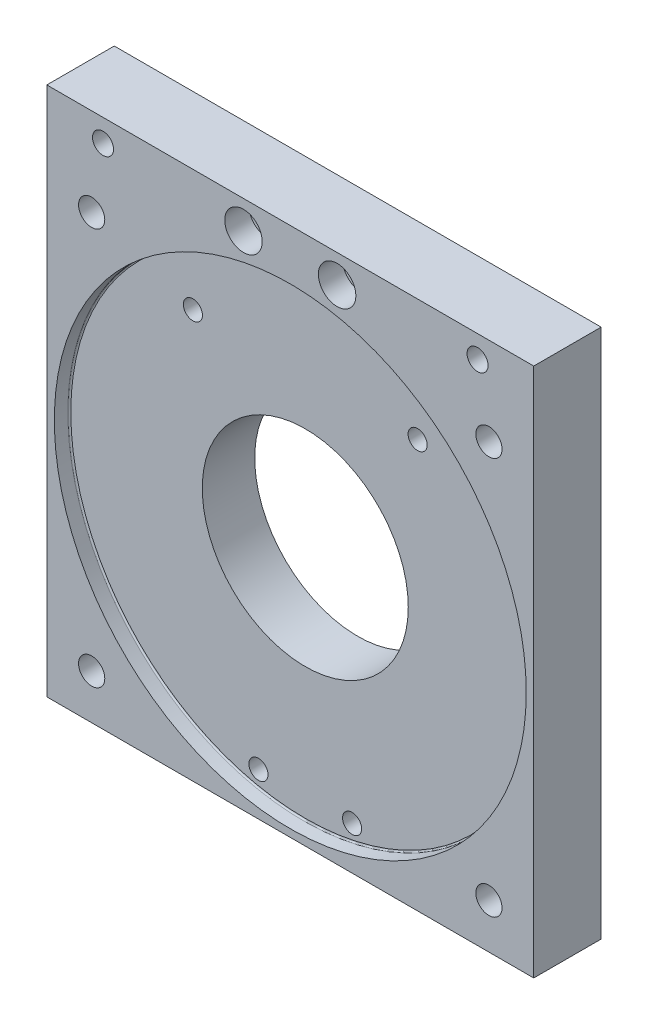
ISO-10303-21;
HEADER;
FILE_DESCRIPTION(('STEP AP214'),'2;1');
FILE_NAME('part.step','',(''),(''),'','','');
FILE_SCHEMA(('AUTOMOTIVE_DESIGN { 1 0 10303 214 1 1 1 1 }'));
ENDSEC;
DATA;
#1=APPLICATION_CONTEXT('core data for automotive mechanical design processes');
#2=APPLICATION_PROTOCOL_DEFINITION('international standard','automotive_design',2000,#1);
#3=PRODUCT_CONTEXT('',#1,'mechanical');
#4=PRODUCT('Part','Part','',(#3));
#5=PRODUCT_RELATED_PRODUCT_CATEGORY('part','',(#4));
#6=PRODUCT_DEFINITION_FORMATION('','',#4);
#7=PRODUCT_DEFINITION_CONTEXT('part definition',#1,'design');
#8=PRODUCT_DEFINITION('design','',#6,#7);
#9=PRODUCT_DEFINITION_SHAPE('','',#8);
#10=(LENGTH_UNIT() NAMED_UNIT(*) SI_UNIT(.MILLI.,.METRE.));
#11=(NAMED_UNIT(*) PLANE_ANGLE_UNIT() SI_UNIT($,.RADIAN.));
#12=(NAMED_UNIT(*) SI_UNIT($,.STERADIAN.) SOLID_ANGLE_UNIT());
#13=UNCERTAINTY_MEASURE_WITH_UNIT(LENGTH_MEASURE(1.E-05),#10,'distance_accuracy_value','');
#14=(GEOMETRIC_REPRESENTATION_CONTEXT(3) GLOBAL_UNCERTAINTY_ASSIGNED_CONTEXT((#13)) GLOBAL_UNIT_ASSIGNED_CONTEXT((#10,
#11,#12)) REPRESENTATION_CONTEXT('',''));
#15=CARTESIAN_POINT('',(0.,0.,0.));
#16=DIRECTION('',(0.,0.,1.));
#17=DIRECTION('',(1.,0.,0.));
#18=AXIS2_PLACEMENT_3D('',#15,#16,#17);
#19=CARTESIAN_POINT('',(-130.,130.,50.8));
#20=DIRECTION('',(1.,0.,0.));
#21=DIRECTION('',(0.,1.,0.));
#22=AXIS2_PLACEMENT_3D('',#19,#20,#21);
#23=PLANE('',#22);
#24=DIRECTION('',(0.,0.,-1.));
#25=VECTOR('',#24,1.);
#26=CARTESIAN_POINT('',(-130.,-130.,50.8));
#27=LINE('',#26,#25);
#28=CARTESIAN_POINT('',(-130.,-130.,43.4));
#29=VERTEX_POINT('',#28);
#30=CARTESIAN_POINT('',(-130.,-130.,7.4));
#31=VERTEX_POINT('',#30);
#32=EDGE_CURVE('E89',#29,#31,#27,.T.);
#33=ORIENTED_EDGE('',*,*,#32,.F.);
#34=DIRECTION('',(0.,1.,0.));
#35=VECTOR('',#34,1.);
#36=CARTESIAN_POINT('',(-130.,-130.,43.4));
#37=LINE('',#36,#35);
#38=CARTESIAN_POINT('',(-130.,153.,43.4));
#39=VERTEX_POINT('',#38);
#40=EDGE_CURVE('E78',#29,#39,#37,.T.);
#41=ORIENTED_EDGE('',*,*,#40,.T.);
#42=DIRECTION('',(0.,0.,-1.));
#43=VECTOR('',#42,1.);
#44=CARTESIAN_POINT('',(-130.,153.,50.8));
#45=LINE('',#44,#43);
#46=CARTESIAN_POINT('',(-130.,153.,7.4));
#47=VERTEX_POINT('',#46);
#48=EDGE_CURVE('E61',#39,#47,#45,.T.);
#49=ORIENTED_EDGE('',*,*,#48,.T.);
#50=DIRECTION('',(0.,-1.,0.));
#51=VECTOR('',#50,1.);
#52=CARTESIAN_POINT('',(-130.,153.,7.4));
#53=LINE('',#52,#51);
#54=EDGE_CURVE('E93',#47,#31,#53,.T.);
#55=ORIENTED_EDGE('',*,*,#54,.T.);
#56=EDGE_LOOP('',(#33,#41,#49,#55));
#57=FACE_BOUND('',#56,.T.);
#58=ADVANCED_FACE('F36',(#57),#23,.F.);
#59=CARTESIAN_POINT('',(-130.,-130.,50.8));
#60=DIRECTION('',(0.,1.,0.));
#61=DIRECTION('',(0.,0.,1.));
#62=AXIS2_PLACEMENT_3D('',#59,#60,#61);
#63=PLANE('',#62);
#64=DIRECTION('',(0.,0.,-1.));
#65=VECTOR('',#64,1.);
#66=CARTESIAN_POINT('',(130.,-130.,50.8));
#67=LINE('',#66,#65);
#68=CARTESIAN_POINT('',(130.,-130.,43.4));
#69=VERTEX_POINT('',#68);
#70=CARTESIAN_POINT('',(130.,-130.,7.4));
#71=VERTEX_POINT('',#70);
#72=EDGE_CURVE('E91',#69,#71,#67,.T.);
#73=ORIENTED_EDGE('',*,*,#72,.F.);
#74=DIRECTION('',(1.,0.,0.));
#75=VECTOR('',#74,1.);
#76=CARTESIAN_POINT('',(-130.,-130.,43.4));
#77=LINE('',#76,#75);
#78=EDGE_CURVE('E81',#29,#69,#77,.T.);
#79=ORIENTED_EDGE('',*,*,#78,.F.);
#80=ORIENTED_EDGE('',*,*,#32,.T.);
#81=DIRECTION('',(1.,0.,0.));
#82=VECTOR('',#81,1.);
#83=CARTESIAN_POINT('',(-130.,-130.,7.4));
#84=LINE('',#83,#82);
#85=EDGE_CURVE('E208',#31,#71,#84,.T.);
#86=ORIENTED_EDGE('',*,*,#85,.T.);
#87=EDGE_LOOP('',(#73,#79,#80,#86));
#88=FACE_BOUND('',#87,.T.);
#89=ADVANCED_FACE('F87',(#88),#63,.F.);
#90=CARTESIAN_POINT('',(130.,153.,50.8));
#91=DIRECTION('',(-1.,0.,0.));
#92=DIRECTION('',(0.,0.,1.));
#93=AXIS2_PLACEMENT_3D('',#90,#91,#92);
#94=PLANE('',#93);
#95=DIRECTION('',(0.,0.,-1.));
#96=VECTOR('',#95,1.);
#97=CARTESIAN_POINT('',(130.,153.,50.8));
#98=LINE('',#97,#96);
#99=CARTESIAN_POINT('',(130.,153.,43.4));
#100=VERTEX_POINT('',#99);
#101=CARTESIAN_POINT('',(130.,153.,7.4));
#102=VERTEX_POINT('',#101);
#103=EDGE_CURVE('E97',#100,#102,#98,.T.);
#104=ORIENTED_EDGE('',*,*,#103,.F.);
#105=DIRECTION('',(0.,1.,0.));
#106=VECTOR('',#105,1.);
#107=CARTESIAN_POINT('',(130.,-130.,43.4));
#108=LINE('',#107,#106);
#109=EDGE_CURVE('E53',#69,#100,#108,.T.);
#110=ORIENTED_EDGE('',*,*,#109,.F.);
#111=ORIENTED_EDGE('',*,*,#72,.T.);
#112=DIRECTION('',(0.,-1.,0.));
#113=VECTOR('',#112,1.);
#114=CARTESIAN_POINT('',(130.,153.,7.4));
#115=LINE('',#114,#113);
#116=EDGE_CURVE('E202',#102,#71,#115,.T.);
#117=ORIENTED_EDGE('',*,*,#116,.F.);
#118=EDGE_LOOP('',(#104,#110,#111,#117));
#119=FACE_BOUND('',#118,.T.);
#120=ADVANCED_FACE('F220',(#119),#94,.F.);
#121=CARTESIAN_POINT('',(-130.,153.,50.8));
#122=DIRECTION('',(0.,-1.,0.));
#123=DIRECTION('',(0.,0.,-1.));
#124=AXIS2_PLACEMENT_3D('',#121,#122,#123);
#125=PLANE('',#124);
#126=ORIENTED_EDGE('',*,*,#48,.F.);
#127=DIRECTION('',(1.,0.,0.));
#128=VECTOR('',#127,1.);
#129=CARTESIAN_POINT('',(-130.,153.,43.4));
#130=LINE('',#129,#128);
#131=EDGE_CURVE('E82',#39,#100,#130,.T.);
#132=ORIENTED_EDGE('',*,*,#131,.T.);
#133=ORIENTED_EDGE('',*,*,#103,.T.);
#134=DIRECTION('',(1.,0.,0.));
#135=VECTOR('',#134,1.);
#136=CARTESIAN_POINT('',(-130.,153.,7.4));
#137=LINE('',#136,#135);
#138=EDGE_CURVE('E205',#47,#102,#137,.T.);
#139=ORIENTED_EDGE('',*,*,#138,.F.);
#140=EDGE_LOOP('',(#126,#132,#133,#139));
#141=FACE_BOUND('',#140,.T.);
#142=ADVANCED_FACE('F215',(#141),#125,.F.);
#143=CARTESIAN_POINT('',(-130.,153.,7.4));
#144=DIRECTION('',(0.,0.,1.));
#145=DIRECTION('',(0.,-1.,0.));
#146=AXIS2_PLACEMENT_3D('',#143,#144,#145);
#147=PLANE('',#146);
#148=CARTESIAN_POINT('',(-100.,141.,7.4));
#149=DIRECTION('',(0.,0.,-1.));
#150=DIRECTION('',(0.,1.,0.));
#151=AXIS2_PLACEMENT_3D('',#148,#149,#150);
#152=CIRCLE('',#151,2.5);
#153=CARTESIAN_POINT('',(-100.,143.5,7.4));
#154=VERTEX_POINT('',#153);
#155=EDGE_CURVE('E115',#154,#154,#152,.T.);
#156=ORIENTED_EDGE('',*,*,#155,.F.);
#157=EDGE_LOOP('',(#156));
#158=FACE_BOUND('',#157,.T.);
#159=CARTESIAN_POINT('',(100.,141.,7.4));
#160=DIRECTION('',(0.,0.,-1.));
#161=DIRECTION('',(0.,1.,0.));
#162=AXIS2_PLACEMENT_3D('',#159,#160,#161);
#163=CIRCLE('',#162,2.5);
#164=CARTESIAN_POINT('',(100.,143.5,7.4));
#165=VERTEX_POINT('',#164);
#166=EDGE_CURVE('E120',#165,#165,#163,.T.);
#167=ORIENTED_EDGE('',*,*,#166,.F.);
#168=EDGE_LOOP('',(#167));
#169=FACE_BOUND('',#168,.T.);
#170=CARTESIAN_POINT('',(60.,80.,7.4));
#171=DIRECTION('',(0.,0.,-1.));
#172=DIRECTION('',(-1.,0.,0.));
#173=AXIS2_PLACEMENT_3D('',#170,#171,#172);
#174=CIRCLE('',#173,5.09999999999999);
#175=CARTESIAN_POINT('',(54.9,80.,7.4));
#176=VERTEX_POINT('',#175);
#177=EDGE_CURVE('E112',#176,#176,#174,.T.);
#178=ORIENTED_EDGE('',*,*,#177,.F.);
#179=EDGE_LOOP('',(#178));
#180=FACE_BOUND('',#179,.T.);
#181=CARTESIAN_POINT('',(-60.,80.,7.4));
#182=DIRECTION('',(0.,0.,-1.));
#183=DIRECTION('',(-1.,0.,0.));
#184=AXIS2_PLACEMENT_3D('',#181,#182,#183);
#185=CIRCLE('',#184,5.09999999999999);
#186=CARTESIAN_POINT('',(-65.1,80.,7.4));
#187=VERTEX_POINT('',#186);
#188=EDGE_CURVE('E109',#187,#187,#185,.T.);
#189=ORIENTED_EDGE('',*,*,#188,.F.);
#190=EDGE_LOOP('',(#189));
#191=FACE_BOUND('',#190,.T.);
#192=CARTESIAN_POINT('',(-25.,-115.,7.4));
#193=DIRECTION('',(0.,0.,-1.));
#194=DIRECTION('',(-1.,0.,0.));
#195=AXIS2_PLACEMENT_3D('',#192,#193,#194);
#196=CIRCLE('',#195,5.09999999999999);
#197=CARTESIAN_POINT('',(-30.1,-115.,7.4));
#198=VERTEX_POINT('',#197);
#199=EDGE_CURVE('E105',#198,#198,#196,.T.);
#200=ORIENTED_EDGE('',*,*,#199,.F.);
#201=EDGE_LOOP('',(#200));
#202=FACE_BOUND('',#201,.T.);
#203=CARTESIAN_POINT('',(25.,-115.,7.4));
#204=DIRECTION('',(0.,0.,-1.));
#205=DIRECTION('',(-1.,0.,0.));
#206=AXIS2_PLACEMENT_3D('',#203,#204,#205);
#207=CIRCLE('',#206,5.09999999999999);
#208=CARTESIAN_POINT('',(19.9,-115.,7.4));
#209=VERTEX_POINT('',#208);
#210=EDGE_CURVE('E104',#209,#209,#207,.T.);
#211=ORIENTED_EDGE('',*,*,#210,.F.);
#212=EDGE_LOOP('',(#211));
#213=FACE_BOUND('',#212,.T.);
#214=CARTESIAN_POINT('',(-25.0000000000001,138.,7.40000000000001));
#215=DIRECTION('',(0.,0.,1.));
#216=DIRECTION('',(1.,0.,0.));
#217=AXIS2_PLACEMENT_3D('',#214,#215,#216);
#218=CIRCLE('',#217,6.74999999999999);
#219=CARTESIAN_POINT('',(-18.2500000000001,138.,7.40000000000001));
#220=VERTEX_POINT('',#219);
#221=EDGE_CURVE('E153',#220,#220,#218,.T.);
#222=ORIENTED_EDGE('',*,*,#221,.T.);
#223=EDGE_LOOP('',(#222));
#224=FACE_BOUND('',#223,.T.);
#225=CARTESIAN_POINT('',(25.,138.,7.40000000000001));
#226=DIRECTION('',(0.,0.,1.));
#227=DIRECTION('',(1.,0.,0.));
#228=AXIS2_PLACEMENT_3D('',#225,#226,#227);
#229=CIRCLE('',#228,6.74999999999999);
#230=CARTESIAN_POINT('',(31.75,138.,7.40000000000001));
#231=VERTEX_POINT('',#230);
#232=EDGE_CURVE('E165',#231,#231,#229,.T.);
#233=ORIENTED_EDGE('',*,*,#232,.T.);
#234=EDGE_LOOP('',(#233));
#235=FACE_BOUND('',#234,.T.);
#236=CARTESIAN_POINT('',(0.,0.,7.4));
#237=DIRECTION('',(0.,0.,1.));
#238=DIRECTION('',(1.,0.,0.));
#239=AXIS2_PLACEMENT_3D('',#236,#237,#238);
#240=CIRCLE('',#239,55.);
#241=CARTESIAN_POINT('',(55.,0.,7.4));
#242=VERTEX_POINT('',#241);
#243=EDGE_CURVE('E169',#242,#242,#240,.T.);
#244=ORIENTED_EDGE('',*,*,#243,.T.);
#245=EDGE_LOOP('',(#244));
#246=FACE_BOUND('',#245,.T.);
#247=CARTESIAN_POINT('',(-106.066017177982,106.066017177982,7.4));
#248=DIRECTION('',(0.,0.,1.));
#249=DIRECTION('',(1.,0.,0.));
#250=AXIS2_PLACEMENT_3D('',#247,#248,#249);
#251=CIRCLE('',#250,6.99999999999999);
#252=CARTESIAN_POINT('',(-99.0660171779821,106.066017177982,7.4));
#253=VERTEX_POINT('',#252);
#254=EDGE_CURVE('E177',#253,#253,#251,.T.);
#255=ORIENTED_EDGE('',*,*,#254,.T.);
#256=EDGE_LOOP('',(#255));
#257=FACE_BOUND('',#256,.T.);
#258=CARTESIAN_POINT('',(106.066017177982,106.066017177982,7.4));
#259=DIRECTION('',(0.,0.,1.));
#260=DIRECTION('',(1.,0.,0.));
#261=AXIS2_PLACEMENT_3D('',#258,#259,#260);
#262=CIRCLE('',#261,6.99999999999999);
#263=CARTESIAN_POINT('',(113.066017177982,106.066017177982,7.4));
#264=VERTEX_POINT('',#263);
#265=EDGE_CURVE('E183',#264,#264,#262,.T.);
#266=ORIENTED_EDGE('',*,*,#265,.T.);
#267=EDGE_LOOP('',(#266));
#268=FACE_BOUND('',#267,.T.);
#269=CARTESIAN_POINT('',(106.066017177982,-106.066017177982,7.4));
#270=DIRECTION('',(0.,0.,1.));
#271=DIRECTION('',(1.,0.,0.));
#272=AXIS2_PLACEMENT_3D('',#269,#270,#271);
#273=CIRCLE('',#272,6.99999999999999);
#274=CARTESIAN_POINT('',(113.066017177982,-106.066017177982,7.4));
#275=VERTEX_POINT('',#274);
#276=EDGE_CURVE('E189',#275,#275,#273,.T.);
#277=ORIENTED_EDGE('',*,*,#276,.T.);
#278=EDGE_LOOP('',(#277));
#279=FACE_BOUND('',#278,.T.);
#280=CARTESIAN_POINT('',(-106.066017177982,-106.066017177982,7.4));
#281=DIRECTION('',(0.,0.,1.));
#282=DIRECTION('',(1.,0.,0.));
#283=AXIS2_PLACEMENT_3D('',#280,#281,#282);
#284=CIRCLE('',#283,6.99999999999999);
#285=CARTESIAN_POINT('',(-99.0660171779821,-106.066017177982,7.4));
#286=VERTEX_POINT('',#285);
#287=EDGE_CURVE('E195',#286,#286,#284,.T.);
#288=ORIENTED_EDGE('',*,*,#287,.T.);
#289=EDGE_LOOP('',(#288));
#290=FACE_BOUND('',#289,.T.);
#291=ORIENTED_EDGE('',*,*,#116,.T.);
#292=ORIENTED_EDGE('',*,*,#85,.F.);
#293=ORIENTED_EDGE('',*,*,#54,.F.);
#294=ORIENTED_EDGE('',*,*,#138,.T.);
#295=EDGE_LOOP('',(#291,#292,#293,#294));
#296=FACE_BOUND('',#295,.T.);
#297=ADVANCED_FACE('F219',(#158,#169,#180,#191,#202,#213,#224,#235,#246,#257,#268,#279,#290,
#296),#147,.F.);
#298=CARTESIAN_POINT('',(-130.,-130.,43.4));
#299=DIRECTION('',(0.,0.,-1.));
#300=DIRECTION('',(-1.,0.,0.));
#301=AXIS2_PLACEMENT_3D('',#298,#299,#300);
#302=PLANE('',#301);
#303=CARTESIAN_POINT('',(100.,141.,43.4));
#304=DIRECTION('',(0.,0.,1.));
#305=DIRECTION('',(1.,0.,0.));
#306=AXIS2_PLACEMENT_3D('',#303,#304,#305);
#307=CIRCLE('',#306,5.59999999999999);
#308=CARTESIAN_POINT('',(105.6,141.,43.4));
#309=VERTEX_POINT('',#308);
#310=EDGE_CURVE('E521',#309,#309,#307,.T.);
#311=ORIENTED_EDGE('',*,*,#310,.F.);
#312=EDGE_LOOP('',(#311));
#313=FACE_BOUND('',#312,.T.);
#314=CARTESIAN_POINT('',(-100.,141.,43.4));
#315=DIRECTION('',(0.,0.,1.));
#316=DIRECTION('',(1.,0.,0.));
#317=AXIS2_PLACEMENT_3D('',#314,#315,#316);
#318=CIRCLE('',#317,5.59999999999999);
#319=CARTESIAN_POINT('',(-94.4,141.,43.4));
#320=VERTEX_POINT('',#319);
#321=EDGE_CURVE('E123',#320,#320,#318,.T.);
#322=ORIENTED_EDGE('',*,*,#321,.F.);
#323=EDGE_LOOP('',(#322));
#324=FACE_BOUND('',#323,.T.);
#325=CARTESIAN_POINT('',(-25.0000000000001,138.,43.4));
#326=DIRECTION('',(0.,0.,1.));
#327=DIRECTION('',(1.,0.,0.));
#328=AXIS2_PLACEMENT_3D('',#325,#326,#327);
#329=CIRCLE('',#328,10.);
#330=CARTESIAN_POINT('',(-15.0000000000001,138.,43.4));
#331=VERTEX_POINT('',#330);
#332=EDGE_CURVE('E144',#331,#331,#329,.T.);
#333=ORIENTED_EDGE('',*,*,#332,.F.);
#334=EDGE_LOOP('',(#333));
#335=FACE_BOUND('',#334,.T.);
#336=CARTESIAN_POINT('',(25.,138.,43.4));
#337=DIRECTION('',(0.,0.,1.));
#338=DIRECTION('',(1.,0.,0.));
#339=AXIS2_PLACEMENT_3D('',#336,#337,#338);
#340=CIRCLE('',#339,9.99999999999999);
#341=CARTESIAN_POINT('',(35.,138.,43.4));
#342=VERTEX_POINT('',#341);
#343=EDGE_CURVE('E156',#342,#342,#340,.T.);
#344=ORIENTED_EDGE('',*,*,#343,.F.);
#345=EDGE_LOOP('',(#344));
#346=FACE_BOUND('',#345,.T.);
#347=CARTESIAN_POINT('',(-106.066017177982,106.066017177982,43.4));
#348=DIRECTION('',(0.,0.,1.));
#349=DIRECTION('',(1.,0.,0.));
#350=AXIS2_PLACEMENT_3D('',#347,#348,#349);
#351=CIRCLE('',#350,6.99999999999999);
#352=CARTESIAN_POINT('',(-99.0660171779821,106.066017177982,43.4));
#353=VERTEX_POINT('',#352);
#354=EDGE_CURVE('E172',#353,#353,#351,.T.);
#355=ORIENTED_EDGE('',*,*,#354,.F.);
#356=EDGE_LOOP('',(#355));
#357=FACE_BOUND('',#356,.T.);
#358=CARTESIAN_POINT('',(106.066017177982,106.066017177982,43.4));
#359=DIRECTION('',(0.,0.,1.));
#360=DIRECTION('',(1.,0.,0.));
#361=AXIS2_PLACEMENT_3D('',#358,#359,#360);
#362=CIRCLE('',#361,6.99999999999999);
#363=CARTESIAN_POINT('',(113.066017177982,106.066017177982,43.4));
#364=VERTEX_POINT('',#363);
#365=EDGE_CURVE('E180',#364,#364,#362,.T.);
#366=ORIENTED_EDGE('',*,*,#365,.F.);
#367=EDGE_LOOP('',(#366));
#368=FACE_BOUND('',#367,.T.);
#369=CARTESIAN_POINT('',(106.066017177982,-106.066017177982,43.4));
#370=DIRECTION('',(0.,0.,1.));
#371=DIRECTION('',(1.,0.,0.));
#372=AXIS2_PLACEMENT_3D('',#369,#370,#371);
#373=CIRCLE('',#372,6.99999999999999);
#374=CARTESIAN_POINT('',(113.066017177982,-106.066017177982,43.4));
#375=VERTEX_POINT('',#374);
#376=EDGE_CURVE('E186',#375,#375,#373,.T.);
#377=ORIENTED_EDGE('',*,*,#376,.F.);
#378=EDGE_LOOP('',(#377));
#379=FACE_BOUND('',#378,.T.);
#380=CARTESIAN_POINT('',(-106.066017177982,-106.066017177982,43.4));
#381=DIRECTION('',(0.,0.,1.));
#382=DIRECTION('',(1.,0.,0.));
#383=AXIS2_PLACEMENT_3D('',#380,#381,#382);
#384=CIRCLE('',#383,6.99999999999999);
#385=CARTESIAN_POINT('',(-99.0660171779821,-106.066017177982,43.4));
#386=VERTEX_POINT('',#385);
#387=EDGE_CURVE('E192',#386,#386,#384,.T.);
#388=ORIENTED_EDGE('',*,*,#387,.F.);
#389=EDGE_LOOP('',(#388));
#390=FACE_BOUND('',#389,.T.);
#391=CARTESIAN_POINT('',(0.,0.,43.4));
#392=DIRECTION('',(0.,0.,1.));
#393=DIRECTION('',(1.,0.,0.));
#394=AXIS2_PLACEMENT_3D('',#391,#392,#393);
#395=CIRCLE('',#394,126.);
#396=CARTESIAN_POINT('',(126.,0.,43.4));
#397=VERTEX_POINT('',#396);
#398=EDGE_CURVE('E198',#397,#397,#395,.T.);
#399=ORIENTED_EDGE('',*,*,#398,.F.);
#400=EDGE_LOOP('',(#399));
#401=FACE_BOUND('',#400,.T.);
#402=ORIENTED_EDGE('',*,*,#109,.T.);
#403=ORIENTED_EDGE('',*,*,#131,.F.);
#404=ORIENTED_EDGE('',*,*,#40,.F.);
#405=ORIENTED_EDGE('',*,*,#78,.T.);
#406=EDGE_LOOP('',(#402,#403,#404,#405));
#407=FACE_BOUND('',#406,.T.);
#408=ADVANCED_FACE('F80',(#313,#324,#335,#346,#357,#368,#379,#390,#401,#407),#302,.F.);
#409=CARTESIAN_POINT('',(0.,0.,35.4));
#410=DIRECTION('',(0.,0.,1.));
#411=DIRECTION('',(1.,0.,0.));
#412=AXIS2_PLACEMENT_3D('',#409,#410,#411);
#413=CYLINDRICAL_SURFACE('',#412,126.);
#414=CARTESIAN_POINT('',(0.,0.,36.19375));
#415=DIRECTION('',(0.,0.,1.));
#416=DIRECTION('',(1.,0.,0.));
#417=AXIS2_PLACEMENT_3D('',#414,#415,#416);
#418=CIRCLE('',#417,126.);
#419=CARTESIAN_POINT('',(126.,0.,36.19375));
#420=VERTEX_POINT('',#419);
#421=EDGE_CURVE('E11',#420,#420,#418,.F.);
#422=ORIENTED_EDGE('',*,*,#421,.T.);
#423=EDGE_LOOP('',(#422));
#424=FACE_BOUND('',#423,.T.);
#425=ORIENTED_EDGE('',*,*,#398,.T.);
#426=EDGE_LOOP('',(#425));
#427=FACE_BOUND('',#426,.T.);
#428=ADVANCED_FACE('F313',(#424,#427),#413,.F.);
#429=CARTESIAN_POINT('',(0.,0.,35.4));
#430=DIRECTION('',(0.,0.,1.));
#431=DIRECTION('',(1.,0.,0.));
#432=AXIS2_PLACEMENT_3D('',#429,#430,#431);
#433=PLANE('',#432);
#434=CARTESIAN_POINT('',(60.,80.,35.4));
#435=DIRECTION('',(0.,0.,1.));
#436=DIRECTION('',(1.,0.,0.));
#437=AXIS2_PLACEMENT_3D('',#434,#435,#436);
#438=CIRCLE('',#437,5.09999999999999);
#439=CARTESIAN_POINT('',(65.1,80.,35.4));
#440=VERTEX_POINT('',#439);
#441=EDGE_CURVE('E110',#440,#440,#438,.T.);
#442=ORIENTED_EDGE('',*,*,#441,.F.);
#443=EDGE_LOOP('',(#442));
#444=FACE_BOUND('',#443,.T.);
#445=CARTESIAN_POINT('',(-60.,80.,35.4));
#446=DIRECTION('',(0.,0.,1.));
#447=DIRECTION('',(1.,0.,0.));
#448=AXIS2_PLACEMENT_3D('',#445,#446,#447);
#449=CIRCLE('',#448,5.09999999999999);
#450=CARTESIAN_POINT('',(-54.9,80.,35.4));
#451=VERTEX_POINT('',#450);
#452=EDGE_CURVE('E106',#451,#451,#449,.T.);
#453=ORIENTED_EDGE('',*,*,#452,.F.);
#454=EDGE_LOOP('',(#453));
#455=FACE_BOUND('',#454,.T.);
#456=CARTESIAN_POINT('',(-25.,-115.,35.4));
#457=DIRECTION('',(0.,0.,1.));
#458=DIRECTION('',(1.,0.,0.));
#459=AXIS2_PLACEMENT_3D('',#456,#457,#458);
#460=CIRCLE('',#459,5.09999999999999);
#461=CARTESIAN_POINT('',(-19.9,-115.,35.4));
#462=VERTEX_POINT('',#461);
#463=EDGE_CURVE('E101',#462,#462,#460,.T.);
#464=ORIENTED_EDGE('',*,*,#463,.F.);
#465=EDGE_LOOP('',(#464));
#466=FACE_BOUND('',#465,.T.);
#467=CARTESIAN_POINT('',(25.,-115.,35.4));
#468=DIRECTION('',(0.,0.,1.));
#469=DIRECTION('',(1.,0.,0.));
#470=AXIS2_PLACEMENT_3D('',#467,#468,#469);
#471=CIRCLE('',#470,5.09999999999999);
#472=CARTESIAN_POINT('',(30.1,-115.,35.4));
#473=VERTEX_POINT('',#472);
#474=EDGE_CURVE('E141',#473,#473,#471,.T.);
#475=ORIENTED_EDGE('',*,*,#474,.F.);
#476=EDGE_LOOP('',(#475));
#477=FACE_BOUND('',#476,.T.);
#478=CARTESIAN_POINT('',(0.,0.,35.4));
#479=DIRECTION('',(0.,0.,1.));
#480=DIRECTION('',(1.,0.,0.));
#481=AXIS2_PLACEMENT_3D('',#478,#479,#480);
#482=CIRCLE('',#481,125.20625);
#483=CARTESIAN_POINT('',(125.20625,0.,35.4));
#484=VERTEX_POINT('',#483);
#485=EDGE_CURVE('E45',#484,#484,#482,.T.);
#486=ORIENTED_EDGE('',*,*,#485,.T.);
#487=EDGE_LOOP('',(#486));
#488=FACE_BOUND('',#487,.T.);
#489=CARTESIAN_POINT('',(0.,0.,35.4));
#490=DIRECTION('',(0.,0.,1.));
#491=DIRECTION('',(1.,0.,0.));
#492=AXIS2_PLACEMENT_3D('',#489,#490,#491);
#493=CIRCLE('',#492,55.);
#494=CARTESIAN_POINT('',(55.,0.,35.4));
#495=VERTEX_POINT('',#494);
#496=EDGE_CURVE('E168',#495,#495,#493,.T.);
#497=ORIENTED_EDGE('',*,*,#496,.F.);
#498=EDGE_LOOP('',(#497));
#499=FACE_BOUND('',#498,.T.);
#500=ADVANCED_FACE('F261',(#444,#455,#466,#477,#488,#499),#433,.T.);
#501=CARTESIAN_POINT('',(-106.066017177982,-106.066017177982,43.4));
#502=DIRECTION('',(0.,0.,1.));
#503=DIRECTION('',(1.,0.,0.));
#504=AXIS2_PLACEMENT_3D('',#501,#502,#503);
#505=CYLINDRICAL_SURFACE('',#504,6.99999999999999);
#506=ORIENTED_EDGE('',*,*,#287,.F.);
#507=EDGE_LOOP('',(#506));
#508=FACE_BOUND('',#507,.T.);
#509=ORIENTED_EDGE('',*,*,#387,.T.);
#510=EDGE_LOOP('',(#509));
#511=FACE_BOUND('',#510,.T.);
#512=ADVANCED_FACE('F254',(#508,#511),#505,.F.);
#513=CARTESIAN_POINT('',(106.066017177982,-106.066017177982,43.4));
#514=DIRECTION('',(0.,0.,1.));
#515=DIRECTION('',(1.,0.,0.));
#516=AXIS2_PLACEMENT_3D('',#513,#514,#515);
#517=CYLINDRICAL_SURFACE('',#516,6.99999999999999);
#518=ORIENTED_EDGE('',*,*,#276,.F.);
#519=EDGE_LOOP('',(#518));
#520=FACE_BOUND('',#519,.T.);
#521=ORIENTED_EDGE('',*,*,#376,.T.);
#522=EDGE_LOOP('',(#521));
#523=FACE_BOUND('',#522,.T.);
#524=ADVANCED_FACE('F260',(#520,#523),#517,.F.);
#525=CARTESIAN_POINT('',(106.066017177982,106.066017177982,43.4));
#526=DIRECTION('',(0.,0.,1.));
#527=DIRECTION('',(1.,0.,0.));
#528=AXIS2_PLACEMENT_3D('',#525,#526,#527);
#529=CYLINDRICAL_SURFACE('',#528,6.99999999999999);
#530=ORIENTED_EDGE('',*,*,#265,.F.);
#531=EDGE_LOOP('',(#530));
#532=FACE_BOUND('',#531,.T.);
#533=ORIENTED_EDGE('',*,*,#365,.T.);
#534=EDGE_LOOP('',(#533));
#535=FACE_BOUND('',#534,.T.);
#536=ADVANCED_FACE('F274',(#532,#535),#529,.F.);
#537=CARTESIAN_POINT('',(-106.066017177982,106.066017177982,43.4));
#538=DIRECTION('',(0.,0.,1.));
#539=DIRECTION('',(1.,0.,0.));
#540=AXIS2_PLACEMENT_3D('',#537,#538,#539);
#541=CYLINDRICAL_SURFACE('',#540,6.99999999999999);
#542=ORIENTED_EDGE('',*,*,#254,.F.);
#543=EDGE_LOOP('',(#542));
#544=FACE_BOUND('',#543,.T.);
#545=ORIENTED_EDGE('',*,*,#354,.T.);
#546=EDGE_LOOP('',(#545));
#547=FACE_BOUND('',#546,.T.);
#548=ADVANCED_FACE('F285',(#544,#547),#541,.F.);
#549=CARTESIAN_POINT('',(0.,0.,7.4));
#550=DIRECTION('',(0.,0.,1.));
#551=DIRECTION('',(1.,0.,0.));
#552=AXIS2_PLACEMENT_3D('',#549,#550,#551);
#553=CYLINDRICAL_SURFACE('',#552,55.);
#554=ORIENTED_EDGE('',*,*,#243,.F.);
#555=EDGE_LOOP('',(#554));
#556=FACE_BOUND('',#555,.T.);
#557=ORIENTED_EDGE('',*,*,#496,.T.);
#558=EDGE_LOOP('',(#557));
#559=FACE_BOUND('',#558,.T.);
#560=ADVANCED_FACE('F296',(#556,#559),#553,.F.);
#561=CARTESIAN_POINT('',(0.,0.,36.19375));
#562=DIRECTION('',(0.,0.,1.));
#563=DIRECTION('',(1.,0.,0.));
#564=AXIS2_PLACEMENT_3D('',#561,#562,#563);
#565=TOROIDAL_SURFACE('',#564,125.20625,0.79375);
#566=ORIENTED_EDGE('',*,*,#421,.F.);
#567=EDGE_LOOP('',(#566));
#568=FACE_BOUND('',#567,.T.);
#569=ORIENTED_EDGE('',*,*,#485,.F.);
#570=EDGE_LOOP('',(#569));
#571=FACE_BOUND('',#570,.T.);
#572=ADVANCED_FACE('F38',(#568,#571),#565,.F.);
#573=CARTESIAN_POINT('',(25.,138.,43.4));
#574=DIRECTION('',(0.,0.,1.));
#575=DIRECTION('',(1.,0.,0.));
#576=AXIS2_PLACEMENT_3D('',#573,#574,#575);
#577=CYLINDRICAL_SURFACE('',#576,6.75);
#578=ORIENTED_EDGE('',*,*,#232,.F.);
#579=EDGE_LOOP('',(#578));
#580=FACE_BOUND('',#579,.T.);
#581=CARTESIAN_POINT('',(25.,138.,30.4));
#582=DIRECTION('',(0.,0.,1.));
#583=DIRECTION('',(1.,0.,0.));
#584=AXIS2_PLACEMENT_3D('',#581,#582,#583);
#585=CIRCLE('',#584,6.75000000000001);
#586=CARTESIAN_POINT('',(31.75,138.,30.4));
#587=VERTEX_POINT('',#586);
#588=EDGE_CURVE('E162',#587,#587,#585,.T.);
#589=ORIENTED_EDGE('',*,*,#588,.T.);
#590=EDGE_LOOP('',(#589));
#591=FACE_BOUND('',#590,.T.);
#592=ADVANCED_FACE('F328',(#580,#591),#577,.F.);
#593=CARTESIAN_POINT('',(31.75,138.,30.4));
#594=DIRECTION('',(0.,0.,-1.));
#595=DIRECTION('',(-1.,0.,0.));
#596=AXIS2_PLACEMENT_3D('',#593,#594,#595);
#597=PLANE('',#596);
#598=ORIENTED_EDGE('',*,*,#588,.F.);
#599=EDGE_LOOP('',(#598));
#600=FACE_BOUND('',#599,.T.);
#601=CARTESIAN_POINT('',(25.,138.,30.4));
#602=DIRECTION('',(0.,0.,1.));
#603=DIRECTION('',(1.,0.,0.));
#604=AXIS2_PLACEMENT_3D('',#601,#602,#603);
#605=CIRCLE('',#604,9.99999999999999);
#606=CARTESIAN_POINT('',(35.,138.,30.4));
#607=VERTEX_POINT('',#606);
#608=EDGE_CURVE('E159',#607,#607,#605,.T.);
#609=ORIENTED_EDGE('',*,*,#608,.T.);
#610=EDGE_LOOP('',(#609));
#611=FACE_BOUND('',#610,.T.);
#612=ADVANCED_FACE('F337',(#600,#611),#597,.F.);
#613=CARTESIAN_POINT('',(25.,138.,43.4));
#614=DIRECTION('',(0.,0.,1.));
#615=DIRECTION('',(1.,0.,0.));
#616=AXIS2_PLACEMENT_3D('',#613,#614,#615);
#617=CYLINDRICAL_SURFACE('',#616,9.99999999999999);
#618=ORIENTED_EDGE('',*,*,#608,.F.);
#619=EDGE_LOOP('',(#618));
#620=FACE_BOUND('',#619,.T.);
#621=ORIENTED_EDGE('',*,*,#343,.T.);
#622=EDGE_LOOP('',(#621));
#623=FACE_BOUND('',#622,.T.);
#624=ADVANCED_FACE('F347',(#620,#623),#617,.F.);
#625=CARTESIAN_POINT('',(-25.0000000000001,138.,43.4));
#626=DIRECTION('',(0.,0.,1.));
#627=DIRECTION('',(1.,0.,0.));
#628=AXIS2_PLACEMENT_3D('',#625,#626,#627);
#629=CYLINDRICAL_SURFACE('',#628,6.75);
#630=ORIENTED_EDGE('',*,*,#221,.F.);
#631=EDGE_LOOP('',(#630));
#632=FACE_BOUND('',#631,.T.);
#633=CARTESIAN_POINT('',(-25.0000000000001,138.,30.4));
#634=DIRECTION('',(0.,0.,1.));
#635=DIRECTION('',(1.,0.,0.));
#636=AXIS2_PLACEMENT_3D('',#633,#634,#635);
#637=CIRCLE('',#636,6.75000000000001);
#638=CARTESIAN_POINT('',(-18.2500000000001,138.,30.4));
#639=VERTEX_POINT('',#638);
#640=EDGE_CURVE('E150',#639,#639,#637,.T.);
#641=ORIENTED_EDGE('',*,*,#640,.T.);
#642=EDGE_LOOP('',(#641));
#643=FACE_BOUND('',#642,.T.);
#644=ADVANCED_FACE('F357',(#632,#643),#629,.F.);
#645=CARTESIAN_POINT('',(-18.2500000000001,138.,30.4));
#646=DIRECTION('',(0.,0.,-1.));
#647=DIRECTION('',(-1.,0.,0.));
#648=AXIS2_PLACEMENT_3D('',#645,#646,#647);
#649=PLANE('',#648);
#650=ORIENTED_EDGE('',*,*,#640,.F.);
#651=EDGE_LOOP('',(#650));
#652=FACE_BOUND('',#651,.T.);
#653=CARTESIAN_POINT('',(-25.0000000000001,138.,30.4));
#654=DIRECTION('',(0.,0.,1.));
#655=DIRECTION('',(1.,0.,0.));
#656=AXIS2_PLACEMENT_3D('',#653,#654,#655);
#657=CIRCLE('',#656,9.99999999999999);
#658=CARTESIAN_POINT('',(-15.0000000000001,138.,30.4));
#659=VERTEX_POINT('',#658);
#660=EDGE_CURVE('E147',#659,#659,#657,.T.);
#661=ORIENTED_EDGE('',*,*,#660,.T.);
#662=EDGE_LOOP('',(#661));
#663=FACE_BOUND('',#662,.T.);
#664=ADVANCED_FACE('F367',(#652,#663),#649,.F.);
#665=CARTESIAN_POINT('',(-25.0000000000001,138.,43.4));
#666=DIRECTION('',(0.,0.,1.));
#667=DIRECTION('',(1.,0.,0.));
#668=AXIS2_PLACEMENT_3D('',#665,#666,#667);
#669=CYLINDRICAL_SURFACE('',#668,9.99999999999999);
#670=ORIENTED_EDGE('',*,*,#660,.F.);
#671=EDGE_LOOP('',(#670));
#672=FACE_BOUND('',#671,.T.);
#673=ORIENTED_EDGE('',*,*,#332,.T.);
#674=EDGE_LOOP('',(#673));
#675=FACE_BOUND('',#674,.T.);
#676=ADVANCED_FACE('F377',(#672,#675),#669,.F.);
#677=CARTESIAN_POINT('',(25.,-115.,7.4));
#678=DIRECTION('',(0.,0.,-1.));
#679=DIRECTION('',(-1.,0.,0.));
#680=AXIS2_PLACEMENT_3D('',#677,#678,#679);
#681=CYLINDRICAL_SURFACE('',#680,5.09999999999999);
#682=ORIENTED_EDGE('',*,*,#474,.T.);
#683=EDGE_LOOP('',(#682));
#684=FACE_BOUND('',#683,.T.);
#685=ORIENTED_EDGE('',*,*,#210,.T.);
#686=EDGE_LOOP('',(#685));
#687=FACE_BOUND('',#686,.T.);
#688=ADVANCED_FACE('F387',(#684,#687),#681,.F.);
#689=CARTESIAN_POINT('',(-25.,-115.,7.4));
#690=DIRECTION('',(0.,0.,-1.));
#691=DIRECTION('',(-1.,0.,0.));
#692=AXIS2_PLACEMENT_3D('',#689,#690,#691);
#693=CYLINDRICAL_SURFACE('',#692,5.09999999999999);
#694=ORIENTED_EDGE('',*,*,#463,.T.);
#695=EDGE_LOOP('',(#694));
#696=FACE_BOUND('',#695,.T.);
#697=ORIENTED_EDGE('',*,*,#199,.T.);
#698=EDGE_LOOP('',(#697));
#699=FACE_BOUND('',#698,.T.);
#700=ADVANCED_FACE('F405',(#696,#699),#693,.F.);
#701=CARTESIAN_POINT('',(-60.,80.,7.4));
#702=DIRECTION('',(0.,0.,-1.));
#703=DIRECTION('',(-1.,0.,0.));
#704=AXIS2_PLACEMENT_3D('',#701,#702,#703);
#705=CYLINDRICAL_SURFACE('',#704,5.09999999999999);
#706=ORIENTED_EDGE('',*,*,#452,.T.);
#707=EDGE_LOOP('',(#706));
#708=FACE_BOUND('',#707,.T.);
#709=ORIENTED_EDGE('',*,*,#188,.T.);
#710=EDGE_LOOP('',(#709));
#711=FACE_BOUND('',#710,.T.);
#712=ADVANCED_FACE('F417',(#708,#711),#705,.F.);
#713=CARTESIAN_POINT('',(60.,80.,7.4));
#714=DIRECTION('',(0.,0.,-1.));
#715=DIRECTION('',(-1.,0.,0.));
#716=AXIS2_PLACEMENT_3D('',#713,#714,#715);
#717=CYLINDRICAL_SURFACE('',#716,5.09999999999999);
#718=ORIENTED_EDGE('',*,*,#441,.T.);
#719=EDGE_LOOP('',(#718));
#720=FACE_BOUND('',#719,.T.);
#721=ORIENTED_EDGE('',*,*,#177,.T.);
#722=EDGE_LOOP('',(#721));
#723=FACE_BOUND('',#722,.T.);
#724=ADVANCED_FACE('F428',(#720,#723),#717,.F.);
#725=CARTESIAN_POINT('',(100.,141.,7.4));
#726=DIRECTION('',(0.,0.,-1.));
#727=DIRECTION('',(0.,1.,0.));
#728=AXIS2_PLACEMENT_3D('',#725,#726,#727);
#729=CYLINDRICAL_SURFACE('',#728,2.5);
#730=CARTESIAN_POINT('',(100.,141.,21.5373320810146));
#731=DIRECTION('',(0.,0.,1.));
#732=DIRECTION('',(1.,0.,0.));
#733=AXIS2_PLACEMENT_3D('',#730,#731,#732);
#734=CIRCLE('',#733,2.5);
#735=CARTESIAN_POINT('',(102.5,141.,21.5373320810146));
#736=VERTEX_POINT('',#735);
#737=EDGE_CURVE('E40',#736,#736,#734,.T.);
#738=ORIENTED_EDGE('',*,*,#737,.T.);
#739=EDGE_LOOP('',(#738));
#740=FACE_BOUND('',#739,.T.);
#741=ORIENTED_EDGE('',*,*,#166,.T.);
#742=EDGE_LOOP('',(#741));
#743=FACE_BOUND('',#742,.T.);
#744=ADVANCED_FACE('F438',(#740,#743),#729,.F.);
#745=CARTESIAN_POINT('',(-100.,141.,7.4));
#746=DIRECTION('',(0.,0.,-1.));
#747=DIRECTION('',(0.,1.,0.));
#748=AXIS2_PLACEMENT_3D('',#745,#746,#747);
#749=CYLINDRICAL_SURFACE('',#748,2.5);
#750=CARTESIAN_POINT('',(-100.,141.,21.5373320810146));
#751=DIRECTION('',(0.,0.,1.));
#752=DIRECTION('',(1.,0.,0.));
#753=AXIS2_PLACEMENT_3D('',#750,#751,#752);
#754=CIRCLE('',#753,2.5);
#755=CARTESIAN_POINT('',(-97.5,141.,21.5373320810146));
#756=VERTEX_POINT('',#755);
#757=EDGE_CURVE('E113',#756,#756,#754,.T.);
#758=ORIENTED_EDGE('',*,*,#757,.T.);
#759=EDGE_LOOP('',(#758));
#760=FACE_BOUND('',#759,.T.);
#761=ORIENTED_EDGE('',*,*,#155,.T.);
#762=EDGE_LOOP('',(#761));
#763=FACE_BOUND('',#762,.T.);
#764=ADVANCED_FACE('F463',(#760,#763),#749,.F.);
#765=CARTESIAN_POINT('',(-100.,141.,23.4));
#766=DIRECTION('',(0.,0.,1.));
#767=DIRECTION('',(1.,0.,0.));
#768=AXIS2_PLACEMENT_3D('',#765,#766,#767);
#769=CONICAL_SURFACE('',#768,5.59999999999999,1.02974425867665);
#770=CARTESIAN_POINT('',(-100.,141.,23.4));
#771=DIRECTION('',(0.,0.,1.));
#772=DIRECTION('',(1.,0.,0.));
#773=AXIS2_PLACEMENT_3D('',#770,#771,#772);
#774=CIRCLE('',#773,5.59999999999999);
#775=CARTESIAN_POINT('',(-94.4,141.,23.4));
#776=VERTEX_POINT('',#775);
#777=EDGE_CURVE('E116',#776,#776,#774,.T.);
#778=ORIENTED_EDGE('',*,*,#777,.T.);
#779=EDGE_LOOP('',(#778));
#780=FACE_BOUND('',#779,.T.);
#781=ORIENTED_EDGE('',*,*,#757,.F.);
#782=EDGE_LOOP('',(#781));
#783=FACE_BOUND('',#782,.T.);
#784=ADVANCED_FACE('F473',(#780,#783),#769,.F.);
#785=CARTESIAN_POINT('',(-100.,141.,43.4));
#786=DIRECTION('',(0.,0.,1.));
#787=DIRECTION('',(1.,0.,0.));
#788=AXIS2_PLACEMENT_3D('',#785,#786,#787);
#789=CYLINDRICAL_SURFACE('',#788,5.59999999999999);
#790=ORIENTED_EDGE('',*,*,#777,.F.);
#791=EDGE_LOOP('',(#790));
#792=FACE_BOUND('',#791,.T.);
#793=ORIENTED_EDGE('',*,*,#321,.T.);
#794=EDGE_LOOP('',(#793));
#795=FACE_BOUND('',#794,.T.);
#796=ADVANCED_FACE('F482',(#792,#795),#789,.F.);
#797=CARTESIAN_POINT('',(100.,141.,23.4));
#798=DIRECTION('',(0.,0.,1.));
#799=DIRECTION('',(1.,0.,0.));
#800=AXIS2_PLACEMENT_3D('',#797,#798,#799);
#801=CONICAL_SURFACE('',#800,5.59999999999999,1.02974425867665);
#802=CARTESIAN_POINT('',(100.,141.,23.4));
#803=DIRECTION('',(0.,0.,1.));
#804=DIRECTION('',(1.,0.,0.));
#805=AXIS2_PLACEMENT_3D('',#802,#803,#804);
#806=CIRCLE('',#805,5.59999999999999);
#807=CARTESIAN_POINT('',(105.6,141.,23.4));
#808=VERTEX_POINT('',#807);
#809=EDGE_CURVE('E518',#808,#808,#806,.T.);
#810=ORIENTED_EDGE('',*,*,#809,.T.);
#811=EDGE_LOOP('',(#810));
#812=FACE_BOUND('',#811,.T.);
#813=ORIENTED_EDGE('',*,*,#737,.F.);
#814=EDGE_LOOP('',(#813));
#815=FACE_BOUND('',#814,.T.);
#816=ADVANCED_FACE('F491',(#812,#815),#801,.F.);
#817=CARTESIAN_POINT('',(100.,141.,43.4));
#818=DIRECTION('',(0.,0.,1.));
#819=DIRECTION('',(1.,0.,0.));
#820=AXIS2_PLACEMENT_3D('',#817,#818,#819);
#821=CYLINDRICAL_SURFACE('',#820,5.59999999999999);
#822=ORIENTED_EDGE('',*,*,#809,.F.);
#823=EDGE_LOOP('',(#822));
#824=FACE_BOUND('',#823,.T.);
#825=ORIENTED_EDGE('',*,*,#310,.T.);
#826=EDGE_LOOP('',(#825));
#827=FACE_BOUND('',#826,.T.);
#828=ADVANCED_FACE('F501',(#824,#827),#821,.F.);
#829=CLOSED_SHELL('',(#58,#89,#120,#142,#297,#408,#428,#500,#512,#524,#536,#548,#560,#572,#592,
#612,#624,#644,#664,#676,#688,#700,#712,#724,#744,#764,#784,#796,#816,#828));
#830=MANIFOLD_SOLID_BREP('B2',#829);
#831=ADVANCED_BREP_SHAPE_REPRESENTATION('',(#18,#830),#14);
#832=SHAPE_DEFINITION_REPRESENTATION(#9,#831);
ENDSEC;
END-ISO-10303-21;
